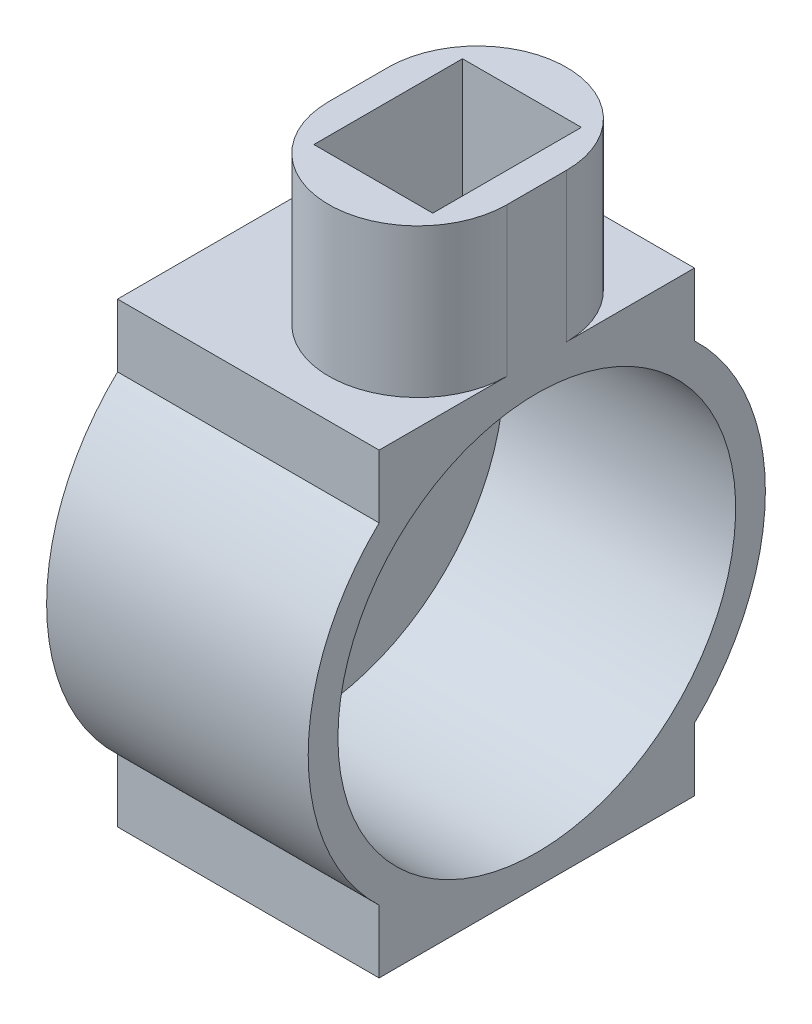
ISO-10303-21;
HEADER;
FILE_DESCRIPTION(('STEP AP214'),'2;1');
FILE_NAME('part.step','',(''),(''),'','','');
FILE_SCHEMA(('AUTOMOTIVE_DESIGN { 1 0 10303 214 1 1 1 1 }'));
ENDSEC;
DATA;
#1=APPLICATION_CONTEXT('core data for automotive mechanical design processes');
#2=APPLICATION_PROTOCOL_DEFINITION('international standard','automotive_design',2000,#1);
#3=PRODUCT_CONTEXT('',#1,'mechanical');
#4=PRODUCT('Part','Part','',(#3));
#5=PRODUCT_RELATED_PRODUCT_CATEGORY('part','',(#4));
#6=PRODUCT_DEFINITION_FORMATION('','',#4);
#7=PRODUCT_DEFINITION_CONTEXT('part definition',#1,'design');
#8=PRODUCT_DEFINITION('design','',#6,#7);
#9=PRODUCT_DEFINITION_SHAPE('','',#8);
#10=(LENGTH_UNIT() NAMED_UNIT(*) SI_UNIT(.MILLI.,.METRE.));
#11=(NAMED_UNIT(*) PLANE_ANGLE_UNIT() SI_UNIT($,.RADIAN.));
#12=(NAMED_UNIT(*) SI_UNIT($,.STERADIAN.) SOLID_ANGLE_UNIT());
#13=UNCERTAINTY_MEASURE_WITH_UNIT(LENGTH_MEASURE(1.E-05),#10,'distance_accuracy_value','');
#14=(GEOMETRIC_REPRESENTATION_CONTEXT(3) GLOBAL_UNCERTAINTY_ASSIGNED_CONTEXT((#13)) GLOBAL_UNIT_ASSIGNED_CONTEXT((#10,
#11,#12)) REPRESENTATION_CONTEXT('',''));
#15=CARTESIAN_POINT('',(0.,0.,0.));
#16=DIRECTION('',(0.,0.,1.));
#17=DIRECTION('',(1.,0.,0.));
#18=AXIS2_PLACEMENT_3D('',#15,#16,#17);
#19=CARTESIAN_POINT('',(0.,38.45,0.));
#20=DIRECTION('',(0.,1.,0.));
#21=DIRECTION('',(0.,0.,1.));
#22=AXIS2_PLACEMENT_3D('',#19,#20,#21);
#23=PLANE('',#22);
#24=DIRECTION('',(0.,0.,1.));
#25=VECTOR('',#24,1.);
#26=CARTESIAN_POINT('',(-11.5,38.45,0.));
#27=LINE('',#26,#25);
#28=CARTESIAN_POINT('',(-11.5,38.45,-26.52));
#29=VERTEX_POINT('',#28);
#30=CARTESIAN_POINT('',(-11.5,38.45,-5.));
#31=VERTEX_POINT('',#30);
#32=EDGE_CURVE('E242',#29,#31,#27,.T.);
#33=ORIENTED_EDGE('',*,*,#32,.F.);
#34=DIRECTION('',(-1.,0.,0.));
#35=VECTOR('',#34,1.);
#36=CARTESIAN_POINT('',(-55.5,38.45,-26.52));
#37=LINE('',#36,#35);
#38=CARTESIAN_POINT('',(-55.5,38.45,-26.52));
#39=VERTEX_POINT('',#38);
#40=EDGE_CURVE('E206',#29,#39,#37,.T.);
#41=ORIENTED_EDGE('',*,*,#40,.T.);
#42=DIRECTION('',(0.,0.,1.));
#43=VECTOR('',#42,1.);
#44=CARTESIAN_POINT('',(-55.5,38.45,-26.52));
#45=LINE('',#44,#43);
#46=CARTESIAN_POINT('',(-55.5,38.45,26.52));
#47=VERTEX_POINT('',#46);
#48=EDGE_CURVE('E198',#39,#47,#45,.T.);
#49=ORIENTED_EDGE('',*,*,#48,.T.);
#50=DIRECTION('',(1.,0.,0.));
#51=VECTOR('',#50,1.);
#52=CARTESIAN_POINT('',(-55.5,38.45,26.52));
#53=LINE('',#52,#51);
#54=CARTESIAN_POINT('',(-11.5,38.45,26.52));
#55=VERTEX_POINT('',#54);
#56=EDGE_CURVE('E192',#47,#55,#53,.T.);
#57=ORIENTED_EDGE('',*,*,#56,.T.);
#58=CARTESIAN_POINT('',(-11.5,38.45,4.99999999999999));
#59=VERTEX_POINT('',#58);
#60=EDGE_CURVE('E173',#59,#55,#27,.T.);
#61=ORIENTED_EDGE('',*,*,#60,.F.);
#62=CARTESIAN_POINT('',(-26.5,38.45,4.99999999999999));
#63=DIRECTION('',(0.,1.,0.));
#64=DIRECTION('',(0.,0.,1.));
#65=AXIS2_PLACEMENT_3D('',#62,#63,#64);
#66=CIRCLE('',#65,15.);
#67=CARTESIAN_POINT('',(-41.5,38.45,4.99999999999999));
#68=VERTEX_POINT('',#67);
#69=EDGE_CURVE('E275',#68,#59,#66,.T.);
#70=ORIENTED_EDGE('',*,*,#69,.F.);
#71=DIRECTION('',(0.,0.,1.));
#72=VECTOR('',#71,1.);
#73=CARTESIAN_POINT('',(-41.5,38.45,-4.99999999999999));
#74=LINE('',#73,#72);
#75=CARTESIAN_POINT('',(-41.5,38.45,-4.99999999999999));
#76=VERTEX_POINT('',#75);
#77=EDGE_CURVE('E288',#76,#68,#74,.T.);
#78=ORIENTED_EDGE('',*,*,#77,.F.);
#79=CARTESIAN_POINT('',(-26.5,38.45,-4.99999999999999));
#80=DIRECTION('',(0.,1.,0.));
#81=DIRECTION('',(0.,0.,1.));
#82=AXIS2_PLACEMENT_3D('',#79,#80,#81);
#83=CIRCLE('',#82,15.);
#84=EDGE_CURVE('E269',#31,#76,#83,.T.);
#85=ORIENTED_EDGE('',*,*,#84,.F.);
#86=EDGE_LOOP('',(#33,#41,#49,#57,#61,#70,#78,#85));
#87=FACE_BOUND('',#86,.T.);
#88=ADVANCED_FACE('F39',(#87),#23,.T.);
#89=CARTESIAN_POINT('',(55.5,0.,0.));
#90=DIRECTION('',(-1.,0.,0.));
#91=DIRECTION('',(0.,0.,1.));
#92=AXIS2_PLACEMENT_3D('',#89,#90,#91);
#93=CYLINDRICAL_SURFACE('',#92,38.45);
#94=DIRECTION('',(-1.,0.,0.));
#95=VECTOR('',#94,1.);
#96=CARTESIAN_POINT('',(55.5,27.84047592984,-26.52));
#97=LINE('',#96,#95);
#98=CARTESIAN_POINT('',(-11.5,27.84047592984,-26.52));
#99=VERTEX_POINT('',#98);
#100=CARTESIAN_POINT('',(-55.5,27.84047592984,-26.52));
#101=VERTEX_POINT('',#100);
#102=EDGE_CURVE('E209',#99,#101,#97,.T.);
#103=ORIENTED_EDGE('',*,*,#102,.F.);
#104=CARTESIAN_POINT('',(-11.5,0.,0.));
#105=DIRECTION('',(-1.,0.,0.));
#106=DIRECTION('',(0.,0.,1.));
#107=AXIS2_PLACEMENT_3D('',#104,#105,#106);
#108=CIRCLE('',#107,38.45);
#109=CARTESIAN_POINT('',(-11.5,-27.84047592984,-26.52));
#110=VERTEX_POINT('',#109);
#111=EDGE_CURVE('E243',#99,#110,#108,.T.);
#112=ORIENTED_EDGE('',*,*,#111,.T.);
#113=DIRECTION('',(-1.,0.,0.));
#114=VECTOR('',#113,1.);
#115=CARTESIAN_POINT('',(55.5,-27.84047592984,-26.52));
#116=LINE('',#115,#114);
#117=CARTESIAN_POINT('',(-55.5,-27.84047592984,-26.52));
#118=VERTEX_POINT('',#117);
#119=EDGE_CURVE('E186',#110,#118,#116,.T.);
#120=ORIENTED_EDGE('',*,*,#119,.T.);
#121=CARTESIAN_POINT('',(-55.5,0.,0.));
#122=DIRECTION('',(1.,0.,0.));
#123=DIRECTION('',(0.,0.,-1.));
#124=AXIS2_PLACEMENT_3D('',#121,#122,#123);
#125=CIRCLE('',#124,38.45);
#126=EDGE_CURVE('E48',#118,#101,#125,.T.);
#127=ORIENTED_EDGE('',*,*,#126,.T.);
#128=EDGE_LOOP('',(#103,#112,#120,#127));
#129=FACE_BOUND('',#128,.T.);
#130=ADVANCED_FACE('F41',(#129),#93,.T.);
#131=CARTESIAN_POINT('',(-11.5,0.,0.));
#132=DIRECTION('',(-1.,0.,0.));
#133=DIRECTION('',(0.,0.,1.));
#134=AXIS2_PLACEMENT_3D('',#131,#132,#133);
#135=CIRCLE('',#134,38.45);
#136=CARTESIAN_POINT('',(-11.5,-27.84047592984,26.52));
#137=VERTEX_POINT('',#136);
#138=CARTESIAN_POINT('',(-11.5,27.84047592984,26.52));
#139=VERTEX_POINT('',#138);
#140=EDGE_CURVE('E157',#137,#139,#135,.T.);
#141=ORIENTED_EDGE('',*,*,#140,.T.);
#142=DIRECTION('',(-1.,0.,0.));
#143=VECTOR('',#142,1.);
#144=CARTESIAN_POINT('',(55.5,27.84047592984,26.52));
#145=LINE('',#144,#143);
#146=CARTESIAN_POINT('',(-55.5,27.84047592984,26.52));
#147=VERTEX_POINT('',#146);
#148=EDGE_CURVE('E199',#147,#139,#145,.F.);
#149=ORIENTED_EDGE('',*,*,#148,.F.);
#150=CARTESIAN_POINT('',(-55.5,-27.84047592984,26.52));
#151=VERTEX_POINT('',#150);
#152=EDGE_CURVE('E11',#147,#151,#125,.T.);
#153=ORIENTED_EDGE('',*,*,#152,.T.);
#154=DIRECTION('',(-1.,0.,0.));
#155=VECTOR('',#154,1.);
#156=CARTESIAN_POINT('',(55.5,-27.84047592984,26.52));
#157=LINE('',#156,#155);
#158=EDGE_CURVE('E184',#151,#137,#157,.F.);
#159=ORIENTED_EDGE('',*,*,#158,.T.);
#160=EDGE_LOOP('',(#141,#149,#153,#159));
#161=FACE_BOUND('',#160,.T.);
#162=ADVANCED_FACE('F340',(#161),#93,.T.);
#163=CARTESIAN_POINT('',(-55.5,0.,0.));
#164=DIRECTION('',(1.,0.,0.));
#165=DIRECTION('',(0.,0.,-1.));
#166=AXIS2_PLACEMENT_3D('',#163,#164,#165);
#167=PLANE('',#166);
#168=ORIENTED_EDGE('',*,*,#152,.F.);
#169=DIRECTION('',(0.,1.,0.));
#170=VECTOR('',#169,1.);
#171=CARTESIAN_POINT('',(-55.5,-38.451,26.52));
#172=LINE('',#171,#170);
#173=EDGE_CURVE('E194',#147,#47,#172,.T.);
#174=ORIENTED_EDGE('',*,*,#173,.T.);
#175=ORIENTED_EDGE('',*,*,#48,.F.);
#176=DIRECTION('',(0.,1.,0.));
#177=VECTOR('',#176,1.);
#178=CARTESIAN_POINT('',(-55.5,-38.451,-26.52));
#179=LINE('',#178,#177);
#180=EDGE_CURVE('E214',#101,#39,#179,.T.);
#181=ORIENTED_EDGE('',*,*,#180,.F.);
#182=ORIENTED_EDGE('',*,*,#126,.F.);
#183=DIRECTION('',(0.,-1.,0.));
#184=VECTOR('',#183,1.);
#185=CARTESIAN_POINT('',(-55.5,38.451,-26.52));
#186=LINE('',#185,#184);
#187=CARTESIAN_POINT('',(-55.5,-38.45,-26.52));
#188=VERTEX_POINT('',#187);
#189=EDGE_CURVE('E334',#118,#188,#186,.T.);
#190=ORIENTED_EDGE('',*,*,#189,.T.);
#191=DIRECTION('',(0.,0.,1.));
#192=VECTOR('',#191,1.);
#193=CARTESIAN_POINT('',(-55.5,-38.45,-26.52));
#194=LINE('',#193,#192);
#195=CARTESIAN_POINT('',(-55.5,-38.45,26.52));
#196=VERTEX_POINT('',#195);
#197=EDGE_CURVE('E180',#188,#196,#194,.T.);
#198=ORIENTED_EDGE('',*,*,#197,.T.);
#199=DIRECTION('',(0.,-1.,0.));
#200=VECTOR('',#199,1.);
#201=CARTESIAN_POINT('',(-55.5,38.451,26.52));
#202=LINE('',#201,#200);
#203=EDGE_CURVE('E177',#151,#196,#202,.T.);
#204=ORIENTED_EDGE('',*,*,#203,.F.);
#205=EDGE_LOOP('',(#168,#174,#175,#181,#182,#190,#198,#204));
#206=FACE_BOUND('',#205,.T.);
#207=ADVANCED_FACE('F234',(#206),#167,.F.);
#208=CARTESIAN_POINT('',(55.5,0.,0.));
#209=DIRECTION('',(-1.,0.,0.));
#210=DIRECTION('',(0.,0.,1.));
#211=AXIS2_PLACEMENT_3D('',#208,#209,#210);
#212=CYLINDRICAL_SURFACE('',#211,33.45);
#213=CARTESIAN_POINT('',(-11.5,0.,0.));
#214=DIRECTION('',(-1.,0.,0.));
#215=DIRECTION('',(0.,0.,1.));
#216=AXIS2_PLACEMENT_3D('',#213,#214,#215);
#217=CIRCLE('',#216,33.45);
#218=CARTESIAN_POINT('',(-11.5,0.,33.45));
#219=VERTEX_POINT('',#218);
#220=EDGE_CURVE('E247',#219,#219,#217,.T.);
#221=ORIENTED_EDGE('',*,*,#220,.F.);
#222=EDGE_LOOP('',(#221));
#223=FACE_BOUND('',#222,.T.);
#224=DIRECTION('',(-1.,0.,0.));
#225=VECTOR('',#224,1.);
#226=CARTESIAN_POINT('',(55.5,31.0266417776723,12.5));
#227=LINE('',#226,#225);
#228=CARTESIAN_POINT('',(-36.5,31.0266417776723,12.5));
#229=VERTEX_POINT('',#228);
#230=CARTESIAN_POINT('',(-16.5,31.0266417776723,12.5));
#231=VERTEX_POINT('',#230);
#232=EDGE_CURVE('E307',#229,#231,#227,.F.);
#233=ORIENTED_EDGE('',*,*,#232,.T.);
#234=CARTESIAN_POINT('',(-16.5,0.,0.));
#235=DIRECTION('',(1.,0.,0.));
#236=DIRECTION('',(0.,0.,-1.));
#237=AXIS2_PLACEMENT_3D('',#234,#235,#236);
#238=CIRCLE('',#237,33.45);
#239=CARTESIAN_POINT('',(-16.5,31.0266417776723,-12.5));
#240=VERTEX_POINT('',#239);
#241=EDGE_CURVE('E319',#231,#240,#238,.F.);
#242=ORIENTED_EDGE('',*,*,#241,.T.);
#243=DIRECTION('',(-1.,0.,0.));
#244=VECTOR('',#243,1.);
#245=CARTESIAN_POINT('',(55.5,31.0266417776723,-12.5));
#246=LINE('',#245,#244);
#247=CARTESIAN_POINT('',(-36.5,31.0266417776723,-12.5));
#248=VERTEX_POINT('',#247);
#249=EDGE_CURVE('E312',#240,#248,#246,.T.);
#250=ORIENTED_EDGE('',*,*,#249,.T.);
#251=CARTESIAN_POINT('',(-36.5,0.,0.));
#252=DIRECTION('',(-1.,0.,0.));
#253=DIRECTION('',(0.,0.,1.));
#254=AXIS2_PLACEMENT_3D('',#251,#252,#253);
#255=CIRCLE('',#254,33.45);
#256=EDGE_CURVE('E325',#248,#229,#255,.F.);
#257=ORIENTED_EDGE('',*,*,#256,.T.);
#258=EDGE_LOOP('',(#233,#242,#250,#257));
#259=FACE_BOUND('',#258,.T.);
#260=CARTESIAN_POINT('',(-50.5,0.,0.));
#261=DIRECTION('',(1.,0.,0.));
#262=DIRECTION('',(0.,0.,-1.));
#263=AXIS2_PLACEMENT_3D('',#260,#261,#262);
#264=CIRCLE('',#263,33.45);
#265=CARTESIAN_POINT('',(-50.5,0.,-33.45));
#266=VERTEX_POINT('',#265);
#267=EDGE_CURVE('E217',#266,#266,#264,.T.);
#268=ORIENTED_EDGE('',*,*,#267,.F.);
#269=EDGE_LOOP('',(#268));
#270=FACE_BOUND('',#269,.T.);
#271=ADVANCED_FACE('F386',(#223,#259,#270),#212,.F.);
#272=CARTESIAN_POINT('',(-50.5,0.,0.));
#273=DIRECTION('',(1.,0.,0.));
#274=DIRECTION('',(0.,0.,-1.));
#275=AXIS2_PLACEMENT_3D('',#272,#273,#274);
#276=PLANE('',#275);
#277=ORIENTED_EDGE('',*,*,#267,.T.);
#278=EDGE_LOOP('',(#277));
#279=FACE_BOUND('',#278,.T.);
#280=ADVANCED_FACE('F385',(#279),#276,.T.);
#281=CARTESIAN_POINT('',(-55.5,-38.451,-26.52));
#282=DIRECTION('',(0.,0.,-1.));
#283=DIRECTION('',(-1.,0.,0.));
#284=AXIS2_PLACEMENT_3D('',#281,#282,#283);
#285=PLANE('',#284);
#286=DIRECTION('',(0.,1.,0.));
#287=VECTOR('',#286,1.);
#288=CARTESIAN_POINT('',(-11.5,-38.451,-26.52));
#289=LINE('',#288,#287);
#290=EDGE_CURVE('E239',#99,#29,#289,.T.);
#291=ORIENTED_EDGE('',*,*,#290,.F.);
#292=ORIENTED_EDGE('',*,*,#102,.T.);
#293=ORIENTED_EDGE('',*,*,#180,.T.);
#294=ORIENTED_EDGE('',*,*,#40,.F.);
#295=EDGE_LOOP('',(#291,#292,#293,#294));
#296=FACE_BOUND('',#295,.T.);
#297=ADVANCED_FACE('F238',(#296),#285,.T.);
#298=CARTESIAN_POINT('',(-55.5,-38.451,26.52));
#299=DIRECTION('',(0.,0.,1.));
#300=DIRECTION('',(1.,0.,0.));
#301=AXIS2_PLACEMENT_3D('',#298,#299,#300);
#302=PLANE('',#301);
#303=DIRECTION('',(0.,-1.,0.));
#304=VECTOR('',#303,1.);
#305=CARTESIAN_POINT('',(-11.5,-38.451,26.52));
#306=LINE('',#305,#304);
#307=EDGE_CURVE('E346',#55,#139,#306,.T.);
#308=ORIENTED_EDGE('',*,*,#307,.F.);
#309=ORIENTED_EDGE('',*,*,#56,.F.);
#310=ORIENTED_EDGE('',*,*,#173,.F.);
#311=ORIENTED_EDGE('',*,*,#148,.T.);
#312=EDGE_LOOP('',(#308,#309,#310,#311));
#313=FACE_BOUND('',#312,.T.);
#314=ADVANCED_FACE('F344',(#313),#302,.T.);
#315=CARTESIAN_POINT('',(0.,-38.45,0.));
#316=DIRECTION('',(0.,-1.,0.));
#317=DIRECTION('',(0.,0.,1.));
#318=AXIS2_PLACEMENT_3D('',#315,#316,#317);
#319=PLANE('',#318);
#320=DIRECTION('',(0.,0.,1.));
#321=VECTOR('',#320,1.);
#322=CARTESIAN_POINT('',(-11.5,-38.45,-38.45));
#323=LINE('',#322,#321);
#324=CARTESIAN_POINT('',(-11.5,-38.45,-26.52));
#325=VERTEX_POINT('',#324);
#326=CARTESIAN_POINT('',(-11.5,-38.45,26.52));
#327=VERTEX_POINT('',#326);
#328=EDGE_CURVE('E55',#325,#327,#323,.T.);
#329=ORIENTED_EDGE('',*,*,#328,.T.);
#330=DIRECTION('',(1.,0.,0.));
#331=VECTOR('',#330,1.);
#332=CARTESIAN_POINT('',(-55.5,-38.45,26.52));
#333=LINE('',#332,#331);
#334=EDGE_CURVE('E170',#196,#327,#333,.T.);
#335=ORIENTED_EDGE('',*,*,#334,.F.);
#336=ORIENTED_EDGE('',*,*,#197,.F.);
#337=DIRECTION('',(-1.,0.,0.));
#338=VECTOR('',#337,1.);
#339=CARTESIAN_POINT('',(-55.5,-38.45,-26.52));
#340=LINE('',#339,#338);
#341=EDGE_CURVE('E171',#325,#188,#340,.T.);
#342=ORIENTED_EDGE('',*,*,#341,.F.);
#343=EDGE_LOOP('',(#329,#335,#336,#342));
#344=FACE_BOUND('',#343,.T.);
#345=ADVANCED_FACE('F168',(#344),#319,.T.);
#346=CARTESIAN_POINT('',(-55.5,38.451,26.52));
#347=DIRECTION('',(0.,0.,-1.));
#348=DIRECTION('',(-1.,0.,0.));
#349=AXIS2_PLACEMENT_3D('',#346,#347,#348);
#350=PLANE('',#349);
#351=ORIENTED_EDGE('',*,*,#334,.T.);
#352=DIRECTION('',(0.,1.,0.));
#353=VECTOR('',#352,1.);
#354=CARTESIAN_POINT('',(-11.5,38.451,26.52));
#355=LINE('',#354,#353);
#356=EDGE_CURVE('E152',#327,#137,#355,.T.);
#357=ORIENTED_EDGE('',*,*,#356,.T.);
#358=ORIENTED_EDGE('',*,*,#158,.F.);
#359=ORIENTED_EDGE('',*,*,#203,.T.);
#360=EDGE_LOOP('',(#351,#357,#358,#359));
#361=FACE_BOUND('',#360,.T.);
#362=ADVANCED_FACE('F175',(#361),#350,.F.);
#363=CARTESIAN_POINT('',(-55.5,38.451,-26.52));
#364=DIRECTION('',(0.,0.,1.));
#365=DIRECTION('',(1.,0.,0.));
#366=AXIS2_PLACEMENT_3D('',#363,#364,#365);
#367=PLANE('',#366);
#368=ORIENTED_EDGE('',*,*,#119,.F.);
#369=DIRECTION('',(0.,-1.,0.));
#370=VECTOR('',#369,1.);
#371=CARTESIAN_POINT('',(-11.5,38.451,-26.52));
#372=LINE('',#371,#370);
#373=EDGE_CURVE('E163',#110,#325,#372,.T.);
#374=ORIENTED_EDGE('',*,*,#373,.T.);
#375=ORIENTED_EDGE('',*,*,#341,.T.);
#376=ORIENTED_EDGE('',*,*,#189,.F.);
#377=EDGE_LOOP('',(#368,#374,#375,#376));
#378=FACE_BOUND('',#377,.T.);
#379=ADVANCED_FACE('F338',(#378),#367,.F.);
#380=CARTESIAN_POINT('',(-36.5,-38.451,12.5));
#381=DIRECTION('',(0.,0.,1.));
#382=DIRECTION('',(1.,0.,0.));
#383=AXIS2_PLACEMENT_3D('',#380,#381,#382);
#384=PLANE('',#383);
#385=DIRECTION('',(0.,1.,0.));
#386=VECTOR('',#385,1.);
#387=CARTESIAN_POINT('',(-36.5,-38.451,12.5));
#388=LINE('',#387,#386);
#389=CARTESIAN_POINT('',(-36.5,63.45,12.5));
#390=VERTEX_POINT('',#389);
#391=EDGE_CURVE('E316',#229,#390,#388,.T.);
#392=ORIENTED_EDGE('',*,*,#391,.T.);
#393=DIRECTION('',(1.,0.,0.));
#394=VECTOR('',#393,1.);
#395=CARTESIAN_POINT('',(-36.5,63.45,12.5));
#396=LINE('',#395,#394);
#397=CARTESIAN_POINT('',(-16.5,63.45,12.5));
#398=VERTEX_POINT('',#397);
#399=EDGE_CURVE('E258',#390,#398,#396,.T.);
#400=ORIENTED_EDGE('',*,*,#399,.T.);
#401=DIRECTION('',(0.,1.,0.));
#402=VECTOR('',#401,1.);
#403=CARTESIAN_POINT('',(-16.5,-38.451,12.5));
#404=LINE('',#403,#402);
#405=EDGE_CURVE('E311',#231,#398,#404,.T.);
#406=ORIENTED_EDGE('',*,*,#405,.F.);
#407=ORIENTED_EDGE('',*,*,#232,.F.);
#408=EDGE_LOOP('',(#392,#400,#406,#407));
#409=FACE_BOUND('',#408,.T.);
#410=ADVANCED_FACE('F453',(#409),#384,.F.);
#411=CARTESIAN_POINT('',(-36.5,-38.451,-12.5));
#412=DIRECTION('',(-1.,0.,0.));
#413=DIRECTION('',(0.,0.,1.));
#414=AXIS2_PLACEMENT_3D('',#411,#412,#413);
#415=PLANE('',#414);
#416=DIRECTION('',(0.,1.,0.));
#417=VECTOR('',#416,1.);
#418=CARTESIAN_POINT('',(-36.5,-38.451,-12.5));
#419=LINE('',#418,#417);
#420=CARTESIAN_POINT('',(-36.5,63.45,-12.5));
#421=VERTEX_POINT('',#420);
#422=EDGE_CURVE('E63',#248,#421,#419,.T.);
#423=ORIENTED_EDGE('',*,*,#422,.T.);
#424=DIRECTION('',(0.,0.,1.));
#425=VECTOR('',#424,1.);
#426=CARTESIAN_POINT('',(-36.5,63.45,-12.5));
#427=LINE('',#426,#425);
#428=EDGE_CURVE('E255',#421,#390,#427,.T.);
#429=ORIENTED_EDGE('',*,*,#428,.T.);
#430=ORIENTED_EDGE('',*,*,#391,.F.);
#431=ORIENTED_EDGE('',*,*,#256,.F.);
#432=EDGE_LOOP('',(#423,#429,#430,#431));
#433=FACE_BOUND('',#432,.T.);
#434=ADVANCED_FACE('F442',(#433),#415,.F.);
#435=CARTESIAN_POINT('',(-36.5,-38.451,-12.5));
#436=DIRECTION('',(0.,0.,-1.));
#437=DIRECTION('',(-1.,0.,0.));
#438=AXIS2_PLACEMENT_3D('',#435,#436,#437);
#439=PLANE('',#438);
#440=DIRECTION('',(0.,1.,0.));
#441=VECTOR('',#440,1.);
#442=CARTESIAN_POINT('',(-16.5,-38.451,-12.5));
#443=LINE('',#442,#441);
#444=CARTESIAN_POINT('',(-16.5,63.45,-12.5));
#445=VERTEX_POINT('',#444);
#446=EDGE_CURVE('E320',#240,#445,#443,.T.);
#447=ORIENTED_EDGE('',*,*,#446,.T.);
#448=DIRECTION('',(-1.,0.,0.));
#449=VECTOR('',#448,1.);
#450=CARTESIAN_POINT('',(-16.5,63.45,-12.5));
#451=LINE('',#450,#449);
#452=EDGE_CURVE('E266',#445,#421,#451,.T.);
#453=ORIENTED_EDGE('',*,*,#452,.T.);
#454=ORIENTED_EDGE('',*,*,#422,.F.);
#455=ORIENTED_EDGE('',*,*,#249,.F.);
#456=EDGE_LOOP('',(#447,#453,#454,#455));
#457=FACE_BOUND('',#456,.T.);
#458=ADVANCED_FACE('F430',(#457),#439,.F.);
#459=CARTESIAN_POINT('',(-16.5,-38.451,-12.5));
#460=DIRECTION('',(1.,0.,0.));
#461=DIRECTION('',(0.,0.,-1.));
#462=AXIS2_PLACEMENT_3D('',#459,#460,#461);
#463=PLANE('',#462);
#464=ORIENTED_EDGE('',*,*,#405,.T.);
#465=DIRECTION('',(0.,0.,-1.));
#466=VECTOR('',#465,1.);
#467=CARTESIAN_POINT('',(-16.5,63.45,12.5));
#468=LINE('',#467,#466);
#469=EDGE_CURVE('E262',#398,#445,#468,.T.);
#470=ORIENTED_EDGE('',*,*,#469,.T.);
#471=ORIENTED_EDGE('',*,*,#446,.F.);
#472=ORIENTED_EDGE('',*,*,#241,.F.);
#473=EDGE_LOOP('',(#464,#470,#471,#472));
#474=FACE_BOUND('',#473,.T.);
#475=ADVANCED_FACE('F373',(#474),#463,.F.);
#476=CARTESIAN_POINT('',(-26.5,63.45,-4.99999999999999));
#477=DIRECTION('',(0.,-1.,0.));
#478=DIRECTION('',(0.,0.,-1.));
#479=AXIS2_PLACEMENT_3D('',#476,#477,#478);
#480=CYLINDRICAL_SURFACE('',#479,15.);
#481=ORIENTED_EDGE('',*,*,#84,.T.);
#482=DIRECTION('',(0.,-1.,0.));
#483=VECTOR('',#482,1.);
#484=CARTESIAN_POINT('',(-41.5,63.45,-4.99999999999999));
#485=LINE('',#484,#483);
#486=CARTESIAN_POINT('',(-41.5,63.45,-4.99999999999999));
#487=VERTEX_POINT('',#486);
#488=EDGE_CURVE('E304',#487,#76,#485,.T.);
#489=ORIENTED_EDGE('',*,*,#488,.F.);
#490=CARTESIAN_POINT('',(-26.5,63.45,-4.99999999999999));
#491=DIRECTION('',(0.,1.,0.));
#492=DIRECTION('',(0.,0.,1.));
#493=AXIS2_PLACEMENT_3D('',#490,#491,#492);
#494=CIRCLE('',#493,15.);
#495=CARTESIAN_POINT('',(-11.5,63.45,-4.99999999999999));
#496=VERTEX_POINT('',#495);
#497=EDGE_CURVE('E270',#496,#487,#494,.T.);
#498=ORIENTED_EDGE('',*,*,#497,.F.);
#499=DIRECTION('',(0.,-1.,0.));
#500=VECTOR('',#499,1.);
#501=CARTESIAN_POINT('',(-11.5,63.45,-4.99999999999999));
#502=LINE('',#501,#500);
#503=EDGE_CURVE('E284',#496,#31,#502,.T.);
#504=ORIENTED_EDGE('',*,*,#503,.T.);
#505=EDGE_LOOP('',(#481,#489,#498,#504));
#506=FACE_BOUND('',#505,.T.);
#507=ADVANCED_FACE('F355',(#506),#480,.T.);
#508=CARTESIAN_POINT('',(-41.5,63.45,-4.99999999999999));
#509=DIRECTION('',(1.,0.,0.));
#510=DIRECTION('',(0.,0.,-1.));
#511=AXIS2_PLACEMENT_3D('',#508,#509,#510);
#512=PLANE('',#511);
#513=ORIENTED_EDGE('',*,*,#77,.T.);
#514=DIRECTION('',(0.,-1.,0.));
#515=VECTOR('',#514,1.);
#516=CARTESIAN_POINT('',(-41.5,63.45,4.99999999999999));
#517=LINE('',#516,#515);
#518=CARTESIAN_POINT('',(-41.5,63.45,4.99999999999999));
#519=VERTEX_POINT('',#518);
#520=EDGE_CURVE('E300',#519,#68,#517,.T.);
#521=ORIENTED_EDGE('',*,*,#520,.F.);
#522=DIRECTION('',(0.,0.,1.));
#523=VECTOR('',#522,1.);
#524=CARTESIAN_POINT('',(-41.5,63.45,-4.99999999999999));
#525=LINE('',#524,#523);
#526=EDGE_CURVE('E274',#487,#519,#525,.T.);
#527=ORIENTED_EDGE('',*,*,#526,.F.);
#528=ORIENTED_EDGE('',*,*,#488,.T.);
#529=EDGE_LOOP('',(#513,#521,#527,#528));
#530=FACE_BOUND('',#529,.T.);
#531=ADVANCED_FACE('F365',(#530),#512,.F.);
#532=CARTESIAN_POINT('',(-26.5,63.45,4.99999999999999));
#533=DIRECTION('',(0.,-1.,0.));
#534=DIRECTION('',(0.,0.,-1.));
#535=AXIS2_PLACEMENT_3D('',#532,#533,#534);
#536=CYLINDRICAL_SURFACE('',#535,15.);
#537=ORIENTED_EDGE('',*,*,#69,.T.);
#538=DIRECTION('',(0.,-1.,0.));
#539=VECTOR('',#538,1.);
#540=CARTESIAN_POINT('',(-11.5,63.45,4.99999999999999));
#541=LINE('',#540,#539);
#542=CARTESIAN_POINT('',(-11.5,63.45,4.99999999999999));
#543=VERTEX_POINT('',#542);
#544=EDGE_CURVE('E297',#543,#59,#541,.T.);
#545=ORIENTED_EDGE('',*,*,#544,.F.);
#546=CARTESIAN_POINT('',(-26.5,63.45,4.99999999999999));
#547=DIRECTION('',(0.,1.,0.));
#548=DIRECTION('',(0.,0.,1.));
#549=AXIS2_PLACEMENT_3D('',#546,#547,#548);
#550=CIRCLE('',#549,15.);
#551=EDGE_CURVE('E278',#519,#543,#550,.T.);
#552=ORIENTED_EDGE('',*,*,#551,.F.);
#553=ORIENTED_EDGE('',*,*,#520,.T.);
#554=EDGE_LOOP('',(#537,#545,#552,#553));
#555=FACE_BOUND('',#554,.T.);
#556=ADVANCED_FACE('F363',(#555),#536,.T.);
#557=CARTESIAN_POINT('',(-11.5,63.45,-4.99999999999999));
#558=DIRECTION('',(-1.,0.,0.));
#559=DIRECTION('',(0.,0.,1.));
#560=AXIS2_PLACEMENT_3D('',#557,#558,#559);
#561=PLANE('',#560);
#562=ORIENTED_EDGE('',*,*,#544,.T.);
#563=ORIENTED_EDGE('',*,*,#60,.T.);
#564=ORIENTED_EDGE('',*,*,#307,.T.);
#565=ORIENTED_EDGE('',*,*,#140,.F.);
#566=ORIENTED_EDGE('',*,*,#356,.F.);
#567=ORIENTED_EDGE('',*,*,#328,.F.);
#568=ORIENTED_EDGE('',*,*,#373,.F.);
#569=ORIENTED_EDGE('',*,*,#111,.F.);
#570=ORIENTED_EDGE('',*,*,#290,.T.);
#571=ORIENTED_EDGE('',*,*,#32,.T.);
#572=ORIENTED_EDGE('',*,*,#503,.F.);
#573=DIRECTION('',(0.,0.,-1.));
#574=VECTOR('',#573,1.);
#575=CARTESIAN_POINT('',(-11.5,63.45,-4.99999999999999));
#576=LINE('',#575,#574);
#577=EDGE_CURVE('E281',#543,#496,#576,.T.);
#578=ORIENTED_EDGE('',*,*,#577,.F.);
#579=EDGE_LOOP('',(#562,#563,#564,#565,#566,#567,#568,#569,#570,#571,#572,#578));
#580=FACE_BOUND('',#579,.T.);
#581=ORIENTED_EDGE('',*,*,#220,.T.);
#582=EDGE_LOOP('',(#581));
#583=FACE_BOUND('',#582,.T.);
#584=ADVANCED_FACE('F154',(#580,#583),#561,.F.);
#585=CARTESIAN_POINT('',(-26.5,63.45,-4.99999999999999));
#586=DIRECTION('',(0.,1.,0.));
#587=DIRECTION('',(0.,0.,1.));
#588=AXIS2_PLACEMENT_3D('',#585,#586,#587);
#589=PLANE('',#588);
#590=ORIENTED_EDGE('',*,*,#399,.F.);
#591=ORIENTED_EDGE('',*,*,#428,.F.);
#592=ORIENTED_EDGE('',*,*,#452,.F.);
#593=ORIENTED_EDGE('',*,*,#469,.F.);
#594=EDGE_LOOP('',(#590,#591,#592,#593));
#595=FACE_BOUND('',#594,.T.);
#596=ORIENTED_EDGE('',*,*,#497,.T.);
#597=ORIENTED_EDGE('',*,*,#526,.T.);
#598=ORIENTED_EDGE('',*,*,#551,.T.);
#599=ORIENTED_EDGE('',*,*,#577,.T.);
#600=EDGE_LOOP('',(#596,#597,#598,#599));
#601=FACE_BOUND('',#600,.T.);
#602=ADVANCED_FACE('F358',(#595,#601),#589,.T.);
#603=CLOSED_SHELL('',(#88,#130,#162,#207,#271,#280,#297,#314,#345,#362,#379,#410,#434,#458,#475,
#507,#531,#556,#584,#602));
#604=MANIFOLD_SOLID_BREP('B2',#603);
#605=ADVANCED_BREP_SHAPE_REPRESENTATION('',(#18,#604),#14);
#606=SHAPE_DEFINITION_REPRESENTATION(#9,#605);
ENDSEC;
END-ISO-10303-21;
